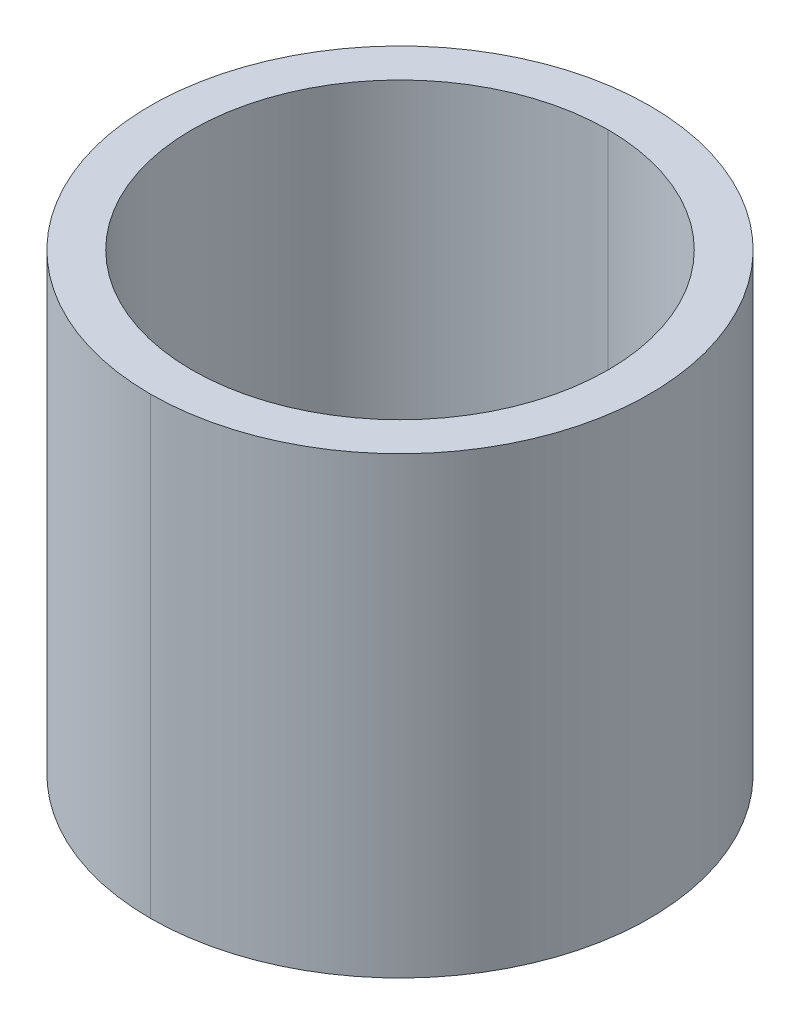
ISO-10303-21;
HEADER;
FILE_DESCRIPTION(('STEP AP214'),'2;1');
FILE_NAME('part.step','',(''),(''),'','','');
FILE_SCHEMA(('AUTOMOTIVE_DESIGN { 1 0 10303 214 1 1 1 1 }'));
ENDSEC;
DATA;
#1=APPLICATION_CONTEXT('core data for automotive mechanical design processes');
#2=APPLICATION_PROTOCOL_DEFINITION('international standard','automotive_design',2000,#1);
#3=PRODUCT_CONTEXT('',#1,'mechanical');
#4=PRODUCT('Part','Part','',(#3));
#5=PRODUCT_RELATED_PRODUCT_CATEGORY('part','',(#4));
#6=PRODUCT_DEFINITION_FORMATION('','',#4);
#7=PRODUCT_DEFINITION_CONTEXT('part definition',#1,'design');
#8=PRODUCT_DEFINITION('design','',#6,#7);
#9=PRODUCT_DEFINITION_SHAPE('','',#8);
#10=(LENGTH_UNIT() NAMED_UNIT(*) SI_UNIT(.MILLI.,.METRE.));
#11=(NAMED_UNIT(*) PLANE_ANGLE_UNIT() SI_UNIT($,.RADIAN.));
#12=(NAMED_UNIT(*) SI_UNIT($,.STERADIAN.) SOLID_ANGLE_UNIT());
#13=UNCERTAINTY_MEASURE_WITH_UNIT(LENGTH_MEASURE(1.E-05),#10,'distance_accuracy_value','');
#14=(GEOMETRIC_REPRESENTATION_CONTEXT(3) GLOBAL_UNCERTAINTY_ASSIGNED_CONTEXT((#13)) GLOBAL_UNIT_ASSIGNED_CONTEXT((#10,
#11,#12)) REPRESENTATION_CONTEXT('',''));
#15=CARTESIAN_POINT('',(0.,0.,0.));
#16=DIRECTION('',(0.,0.,1.));
#17=DIRECTION('',(1.,0.,0.));
#18=AXIS2_PLACEMENT_3D('',#15,#16,#17);
#19=CARTESIAN_POINT('',(0.,10.91,0.));
#20=DIRECTION('',(0.,-1.,0.));
#21=DIRECTION('',(0.,0.,-1.));
#22=AXIS2_PLACEMENT_3D('',#19,#20,#21);
#23=CYLINDRICAL_SURFACE('',#22,10.);
#24=CARTESIAN_POINT('',(0.,10.91,0.));
#25=DIRECTION('',(0.,1.,0.));
#26=DIRECTION('',(0.,0.,1.));
#27=AXIS2_PLACEMENT_3D('',#24,#25,#26);
#28=CIRCLE('',#27,10.);
#29=CARTESIAN_POINT('',(0.,10.91,-10.));
#30=VERTEX_POINT('',#29);
#31=CARTESIAN_POINT('',(0.,10.91,10.));
#32=VERTEX_POINT('',#31);
#33=EDGE_CURVE('E11',#30,#32,#28,.T.);
#34=ORIENTED_EDGE('',*,*,#33,.T.);
#35=DIRECTION('',(0.,-1.,0.));
#36=VECTOR('',#35,1.);
#37=CARTESIAN_POINT('',(0.,10.91,10.));
#38=LINE('',#37,#36);
#39=CARTESIAN_POINT('',(0.,-10.91,10.));
#40=VERTEX_POINT('',#39);
#41=EDGE_CURVE('E27',#32,#40,#38,.T.);
#42=ORIENTED_EDGE('',*,*,#41,.T.);
#43=CARTESIAN_POINT('',(0.,-10.91,0.));
#44=DIRECTION('',(0.,1.,0.));
#45=DIRECTION('',(0.,0.,1.));
#46=AXIS2_PLACEMENT_3D('',#43,#44,#45);
#47=CIRCLE('',#46,10.);
#48=CARTESIAN_POINT('',(0.,-10.91,-10.));
#49=VERTEX_POINT('',#48);
#50=EDGE_CURVE('E121',#49,#40,#47,.T.);
#51=ORIENTED_EDGE('',*,*,#50,.F.);
#52=DIRECTION('',(0.,-1.,0.));
#53=VECTOR('',#52,1.);
#54=CARTESIAN_POINT('',(0.,10.91,-10.));
#55=LINE('',#54,#53);
#56=EDGE_CURVE('E55',#30,#49,#55,.T.);
#57=ORIENTED_EDGE('',*,*,#56,.F.);
#58=EDGE_LOOP('',(#34,#42,#51,#57));
#59=FACE_BOUND('',#58,.T.);
#60=ADVANCED_FACE('F16',(#59),#23,.F.);
#61=CARTESIAN_POINT('',(0.,10.91,0.));
#62=DIRECTION('',(0.,-1.,0.));
#63=DIRECTION('',(0.,0.,-1.));
#64=AXIS2_PLACEMENT_3D('',#61,#62,#63);
#65=CYLINDRICAL_SURFACE('',#64,12.);
#66=CARTESIAN_POINT('',(0.,10.91,0.));
#67=DIRECTION('',(0.,1.,0.));
#68=DIRECTION('',(0.,0.,1.));
#69=AXIS2_PLACEMENT_3D('',#66,#67,#68);
#70=CIRCLE('',#69,12.);
#71=CARTESIAN_POINT('',(0.,10.91,12.));
#72=VERTEX_POINT('',#71);
#73=CARTESIAN_POINT('',(0.,10.91,-12.));
#74=VERTEX_POINT('',#73);
#75=EDGE_CURVE('E97',#72,#74,#70,.T.);
#76=ORIENTED_EDGE('',*,*,#75,.F.);
#77=DIRECTION('',(0.,-1.,0.));
#78=VECTOR('',#77,1.);
#79=CARTESIAN_POINT('',(0.,10.91,12.));
#80=LINE('',#79,#78);
#81=CARTESIAN_POINT('',(0.,-10.91,12.));
#82=VERTEX_POINT('',#81);
#83=EDGE_CURVE('E93',#72,#82,#80,.T.);
#84=ORIENTED_EDGE('',*,*,#83,.T.);
#85=CARTESIAN_POINT('',(0.,-10.91,0.));
#86=DIRECTION('',(0.,1.,0.));
#87=DIRECTION('',(0.,0.,1.));
#88=AXIS2_PLACEMENT_3D('',#85,#86,#87);
#89=CIRCLE('',#88,12.);
#90=CARTESIAN_POINT('',(0.,-10.91,-12.));
#91=VERTEX_POINT('',#90);
#92=EDGE_CURVE('E88',#82,#91,#89,.T.);
#93=ORIENTED_EDGE('',*,*,#92,.T.);
#94=DIRECTION('',(0.,-1.,0.));
#95=VECTOR('',#94,1.);
#96=CARTESIAN_POINT('',(0.,10.91,-12.));
#97=LINE('',#96,#95);
#98=EDGE_CURVE('E75',#74,#91,#97,.T.);
#99=ORIENTED_EDGE('',*,*,#98,.F.);
#100=EDGE_LOOP('',(#76,#84,#93,#99));
#101=FACE_BOUND('',#100,.T.);
#102=ADVANCED_FACE('F96',(#101),#65,.T.);
#103=CARTESIAN_POINT('',(0.,10.91,0.));
#104=DIRECTION('',(0.,1.,0.));
#105=DIRECTION('',(1.,0.,0.));
#106=AXIS2_PLACEMENT_3D('',#103,#104,#105);
#107=PLANE('',#106);
#108=CARTESIAN_POINT('',(0.,10.91,0.));
#109=DIRECTION('',(0.,1.,0.));
#110=DIRECTION('',(0.,0.,1.));
#111=AXIS2_PLACEMENT_3D('',#108,#109,#110);
#112=CIRCLE('',#111,12.);
#113=EDGE_CURVE('E94',#74,#72,#112,.T.);
#114=ORIENTED_EDGE('',*,*,#113,.T.);
#115=ORIENTED_EDGE('',*,*,#75,.T.);
#116=EDGE_LOOP('',(#114,#115));
#117=FACE_BOUND('',#116,.T.);
#118=ORIENTED_EDGE('',*,*,#33,.F.);
#119=CARTESIAN_POINT('',(0.,10.91,0.));
#120=DIRECTION('',(0.,1.,0.));
#121=DIRECTION('',(0.,0.,1.));
#122=AXIS2_PLACEMENT_3D('',#119,#120,#121);
#123=CIRCLE('',#122,10.);
#124=EDGE_CURVE('E102',#32,#30,#123,.T.);
#125=ORIENTED_EDGE('',*,*,#124,.F.);
#126=EDGE_LOOP('',(#118,#125));
#127=FACE_BOUND('',#126,.T.);
#128=ADVANCED_FACE('F136',(#117,#127),#107,.T.);
#129=CARTESIAN_POINT('',(0.,-10.91,0.));
#130=DIRECTION('',(0.,1.,0.));
#131=DIRECTION('',(1.,0.,0.));
#132=AXIS2_PLACEMENT_3D('',#129,#130,#131);
#133=PLANE('',#132);
#134=CARTESIAN_POINT('',(0.,-10.91,0.));
#135=DIRECTION('',(0.,1.,0.));
#136=DIRECTION('',(0.,0.,1.));
#137=AXIS2_PLACEMENT_3D('',#134,#135,#136);
#138=CIRCLE('',#137,12.);
#139=EDGE_CURVE('E20',#91,#82,#138,.T.);
#140=ORIENTED_EDGE('',*,*,#139,.F.);
#141=ORIENTED_EDGE('',*,*,#92,.F.);
#142=EDGE_LOOP('',(#140,#141));
#143=FACE_BOUND('',#142,.T.);
#144=ORIENTED_EDGE('',*,*,#50,.T.);
#145=CARTESIAN_POINT('',(0.,-10.91,0.));
#146=DIRECTION('',(0.,1.,0.));
#147=DIRECTION('',(0.,0.,1.));
#148=AXIS2_PLACEMENT_3D('',#145,#146,#147);
#149=CIRCLE('',#148,10.);
#150=EDGE_CURVE('E107',#40,#49,#149,.T.);
#151=ORIENTED_EDGE('',*,*,#150,.T.);
#152=EDGE_LOOP('',(#144,#151));
#153=FACE_BOUND('',#152,.T.);
#154=ADVANCED_FACE('F90',(#143,#153),#133,.F.);
#155=CARTESIAN_POINT('',(0.,10.91,0.));
#156=DIRECTION('',(0.,-1.,0.));
#157=DIRECTION('',(0.,0.,-1.));
#158=AXIS2_PLACEMENT_3D('',#155,#156,#157);
#159=CYLINDRICAL_SURFACE('',#158,12.);
#160=ORIENTED_EDGE('',*,*,#83,.F.);
#161=ORIENTED_EDGE('',*,*,#113,.F.);
#162=ORIENTED_EDGE('',*,*,#98,.T.);
#163=ORIENTED_EDGE('',*,*,#139,.T.);
#164=EDGE_LOOP('',(#160,#161,#162,#163));
#165=FACE_BOUND('',#164,.T.);
#166=ADVANCED_FACE('F18',(#165),#159,.T.);
#167=CARTESIAN_POINT('',(0.,10.91,0.));
#168=DIRECTION('',(0.,-1.,0.));
#169=DIRECTION('',(0.,0.,-1.));
#170=AXIS2_PLACEMENT_3D('',#167,#168,#169);
#171=CYLINDRICAL_SURFACE('',#170,10.);
#172=ORIENTED_EDGE('',*,*,#41,.F.);
#173=ORIENTED_EDGE('',*,*,#124,.T.);
#174=ORIENTED_EDGE('',*,*,#56,.T.);
#175=ORIENTED_EDGE('',*,*,#150,.F.);
#176=EDGE_LOOP('',(#172,#173,#174,#175));
#177=FACE_BOUND('',#176,.T.);
#178=ADVANCED_FACE('F123',(#177),#171,.F.);
#179=CLOSED_SHELL('',(#60,#102,#128,#154,#166,#178));
#180=MANIFOLD_SOLID_BREP('B1',#179);
#181=ADVANCED_BREP_SHAPE_REPRESENTATION('',(#18,#180),#14);
#182=SHAPE_DEFINITION_REPRESENTATION(#9,#181);
ENDSEC;
END-ISO-10303-21;
